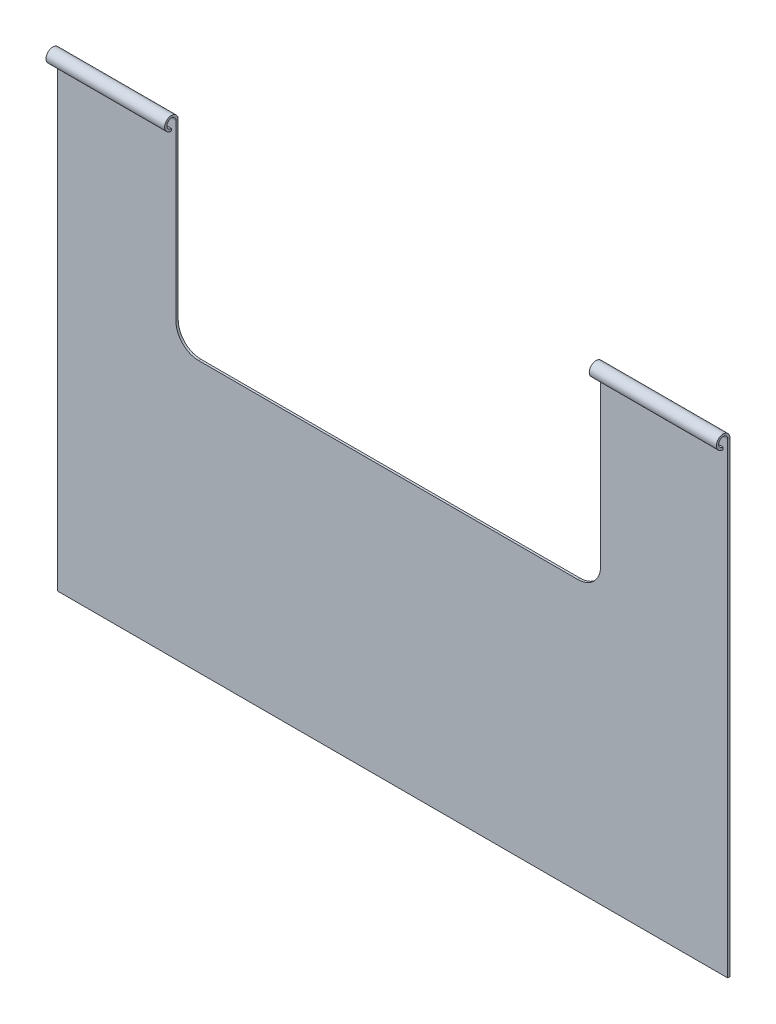
ISO-10303-21;
HEADER;
FILE_DESCRIPTION(('STEP AP214'),'2;1');
FILE_NAME('part.step','',(''),(''),'','','');
FILE_SCHEMA(('AUTOMOTIVE_DESIGN { 1 0 10303 214 1 1 1 1 }'));
ENDSEC;
DATA;
#1=APPLICATION_CONTEXT('core data for automotive mechanical design processes');
#2=APPLICATION_PROTOCOL_DEFINITION('international standard','automotive_design',2000,#1);
#3=PRODUCT_CONTEXT('',#1,'mechanical');
#4=PRODUCT('Part','Part','',(#3));
#5=PRODUCT_RELATED_PRODUCT_CATEGORY('part','',(#4));
#6=PRODUCT_DEFINITION_FORMATION('','',#4);
#7=PRODUCT_DEFINITION_CONTEXT('part definition',#1,'design');
#8=PRODUCT_DEFINITION('design','',#6,#7);
#9=PRODUCT_DEFINITION_SHAPE('','',#8);
#10=(LENGTH_UNIT() NAMED_UNIT(*) SI_UNIT(.MILLI.,.METRE.));
#11=(NAMED_UNIT(*) PLANE_ANGLE_UNIT() SI_UNIT($,.RADIAN.));
#12=(NAMED_UNIT(*) SI_UNIT($,.STERADIAN.) SOLID_ANGLE_UNIT());
#13=UNCERTAINTY_MEASURE_WITH_UNIT(LENGTH_MEASURE(1.E-05),#10,'distance_accuracy_value','');
#14=(GEOMETRIC_REPRESENTATION_CONTEXT(3) GLOBAL_UNCERTAINTY_ASSIGNED_CONTEXT((#13)) GLOBAL_UNIT_ASSIGNED_CONTEXT((#10,
#11,#12)) REPRESENTATION_CONTEXT('',''));
#15=CARTESIAN_POINT('',(0.,0.,0.));
#16=DIRECTION('',(0.,0.,1.));
#17=DIRECTION('',(1.,0.,0.));
#18=AXIS2_PLACEMENT_3D('',#15,#16,#17);
#19=CARTESIAN_POINT('',(45.8957401984779,74.638283062645,-0.5));
#20=DIRECTION('',(-1.,0.,0.));
#21=DIRECTION('',(0.,-1.,0.));
#22=AXIS2_PLACEMENT_3D('',#19,#20,#21);
#23=PLANE('',#22);
#24=DIRECTION('',(0.,-1.,0.));
#25=VECTOR('',#24,1.);
#26=CARTESIAN_POINT('',(45.8957401984779,74.638283062645,-0.5));
#27=LINE('',#26,#25);
#28=CARTESIAN_POINT('',(45.8957401984779,73.138283062645,-0.5));
#29=VERTEX_POINT('',#28);
#30=CARTESIAN_POINT('',(45.8957401984779,34.8052204176334,-0.5));
#31=VERTEX_POINT('',#30);
#32=EDGE_CURVE('E145',#29,#31,#27,.T.);
#33=ORIENTED_EDGE('',*,*,#32,.T.);
#34=DIRECTION('',(0.,0.,1.));
#35=VECTOR('',#34,1.);
#36=CARTESIAN_POINT('',(45.8957401984779,34.8052204176334,0.));
#37=LINE('',#36,#35);
#38=CARTESIAN_POINT('',(45.8957401984779,34.8052204176334,0.));
#39=VERTEX_POINT('',#38);
#40=EDGE_CURVE('E248',#31,#39,#37,.T.);
#41=ORIENTED_EDGE('',*,*,#40,.T.);
#42=DIRECTION('',(0.,-1.,0.));
#43=VECTOR('',#42,1.);
#44=CARTESIAN_POINT('',(45.8957401984779,74.638283062645,0.));
#45=LINE('',#44,#43);
#46=CARTESIAN_POINT('',(45.8957401984779,73.138283062645,0.));
#47=VERTEX_POINT('',#46);
#48=EDGE_CURVE('E222',#47,#39,#45,.T.);
#49=ORIENTED_EDGE('',*,*,#48,.F.);
#50=DIRECTION('',(0.,0.,-1.));
#51=VECTOR('',#50,1.);
#52=CARTESIAN_POINT('',(45.8957401984779,73.138283062645,0.));
#53=LINE('',#52,#51);
#54=EDGE_CURVE('E167',#47,#29,#53,.T.);
#55=ORIENTED_EDGE('',*,*,#54,.T.);
#56=EDGE_LOOP('',(#33,#41,#49,#55));
#57=FACE_BOUND('',#56,.T.);
#58=ADVANCED_FACE('F35',(#57),#23,.T.);
#59=CARTESIAN_POINT('',(-73.9477123562506,-29.8052204176334,-0.5));
#60=DIRECTION('',(-1.,0.,0.));
#61=DIRECTION('',(0.,0.,1.));
#62=AXIS2_PLACEMENT_3D('',#59,#60,#61);
#63=PLANE('',#62);
#64=DIRECTION('',(0.,-1.,0.));
#65=VECTOR('',#64,1.);
#66=CARTESIAN_POINT('',(-73.9477123562506,-29.8052204176334,0.));
#67=LINE('',#66,#65);
#68=CARTESIAN_POINT('',(-73.9477123562506,73.138283062645,0.));
#69=VERTEX_POINT('',#68);
#70=CARTESIAN_POINT('',(-73.9477123562506,-29.8052204176334,0.));
#71=VERTEX_POINT('',#70);
#72=EDGE_CURVE('E241',#69,#71,#67,.T.);
#73=ORIENTED_EDGE('',*,*,#72,.F.);
#74=DIRECTION('',(0.,0.,-1.));
#75=VECTOR('',#74,1.);
#76=CARTESIAN_POINT('',(-73.9477123562506,73.138283062645,0.));
#77=LINE('',#76,#75);
#78=CARTESIAN_POINT('',(-73.9477123562506,73.138283062645,-0.5));
#79=VERTEX_POINT('',#78);
#80=EDGE_CURVE('E198',#69,#79,#77,.T.);
#81=ORIENTED_EDGE('',*,*,#80,.T.);
#82=DIRECTION('',(0.,-1.,0.));
#83=VECTOR('',#82,1.);
#84=CARTESIAN_POINT('',(-73.9477123562506,29.8052204176334,-0.5));
#85=LINE('',#84,#83);
#86=CARTESIAN_POINT('',(-73.9477123562506,-29.8052204176334,-0.5));
#87=VERTEX_POINT('',#86);
#88=EDGE_CURVE('E230',#79,#87,#85,.T.);
#89=ORIENTED_EDGE('',*,*,#88,.T.);
#90=DIRECTION('',(0.,0.,1.));
#91=VECTOR('',#90,1.);
#92=CARTESIAN_POINT('',(-73.9477123562506,-29.8052204176334,-0.5));
#93=LINE('',#92,#91);
#94=EDGE_CURVE('E234',#87,#71,#93,.T.);
#95=ORIENTED_EDGE('',*,*,#94,.T.);
#96=EDGE_LOOP('',(#73,#81,#89,#95));
#97=FACE_BOUND('',#96,.T.);
#98=ADVANCED_FACE('F299',(#97),#63,.T.);
#99=CARTESIAN_POINT('',(73.9477123562506,-29.8052204176334,-0.5));
#100=DIRECTION('',(1.,0.,0.));
#101=DIRECTION('',(0.,0.,-1.));
#102=AXIS2_PLACEMENT_3D('',#99,#100,#101);
#103=PLANE('',#102);
#104=DIRECTION('',(0.,0.,-1.));
#105=VECTOR('',#104,1.);
#106=CARTESIAN_POINT('',(73.9477123562506,73.138283062645,0.));
#107=LINE('',#106,#105);
#108=CARTESIAN_POINT('',(73.9477123562506,73.138283062645,0.));
#109=VERTEX_POINT('',#108);
#110=CARTESIAN_POINT('',(73.9477123562506,73.138283062645,-0.500000000000001));
#111=VERTEX_POINT('',#110);
#112=EDGE_CURVE('E139',#109,#111,#107,.T.);
#113=ORIENTED_EDGE('',*,*,#112,.F.);
#114=DIRECTION('',(0.,1.,0.));
#115=VECTOR('',#114,1.);
#116=CARTESIAN_POINT('',(73.9477123562506,-29.8052204176334,0.));
#117=LINE('',#116,#115);
#118=CARTESIAN_POINT('',(73.9477123562506,-29.8052204176334,0.));
#119=VERTEX_POINT('',#118);
#120=EDGE_CURVE('E146',#119,#109,#117,.T.);
#121=ORIENTED_EDGE('',*,*,#120,.F.);
#122=DIRECTION('',(0.,0.,1.));
#123=VECTOR('',#122,1.);
#124=CARTESIAN_POINT('',(73.9477123562506,-29.8052204176334,-0.5));
#125=LINE('',#124,#123);
#126=CARTESIAN_POINT('',(73.9477123562506,-29.8052204176334,-0.5));
#127=VERTEX_POINT('',#126);
#128=EDGE_CURVE('E141',#127,#119,#125,.T.);
#129=ORIENTED_EDGE('',*,*,#128,.F.);
#130=DIRECTION('',(0.,1.,0.));
#131=VECTOR('',#130,1.);
#132=CARTESIAN_POINT('',(73.9477123562506,29.8052204176334,-0.5));
#133=LINE('',#132,#131);
#134=EDGE_CURVE('E134',#127,#111,#133,.T.);
#135=ORIENTED_EDGE('',*,*,#134,.T.);
#136=EDGE_LOOP('',(#113,#121,#129,#135));
#137=FACE_BOUND('',#136,.T.);
#138=ADVANCED_FACE('F136',(#137),#103,.T.);
#139=CARTESIAN_POINT('',(-73.9477123562506,-29.8052204176334,-0.5));
#140=DIRECTION('',(0.,-1.,0.));
#141=DIRECTION('',(0.,0.,-1.));
#142=AXIS2_PLACEMENT_3D('',#139,#140,#141);
#143=PLANE('',#142);
#144=DIRECTION('',(1.,0.,0.));
#145=VECTOR('',#144,1.);
#146=CARTESIAN_POINT('',(-73.9477123562506,-29.8052204176334,0.));
#147=LINE('',#146,#145);
#148=EDGE_CURVE('E243',#71,#119,#147,.T.);
#149=ORIENTED_EDGE('',*,*,#148,.F.);
#150=ORIENTED_EDGE('',*,*,#94,.F.);
#151=DIRECTION('',(1.,0.,0.));
#152=VECTOR('',#151,1.);
#153=CARTESIAN_POINT('',(-73.9477123562506,-29.8052204176334,-0.5));
#154=LINE('',#153,#152);
#155=EDGE_CURVE('E232',#87,#127,#154,.T.);
#156=ORIENTED_EDGE('',*,*,#155,.T.);
#157=ORIENTED_EDGE('',*,*,#128,.T.);
#158=EDGE_LOOP('',(#149,#150,#156,#157));
#159=FACE_BOUND('',#158,.T.);
#160=ADVANCED_FACE('F347',(#159),#143,.T.);
#161=CARTESIAN_POINT('',(-47.7778096855128,74.638283062645,-0.5));
#162=DIRECTION('',(1.,0.,0.));
#163=DIRECTION('',(0.,0.,-1.));
#164=AXIS2_PLACEMENT_3D('',#161,#162,#163);
#165=PLANE('',#164);
#166=DIRECTION('',(0.,1.,0.));
#167=VECTOR('',#166,1.);
#168=CARTESIAN_POINT('',(-47.7778096855128,74.638283062645,0.));
#169=LINE('',#168,#167);
#170=CARTESIAN_POINT('',(-47.7778096855128,34.8052204176334,0.));
#171=VERTEX_POINT('',#170);
#172=CARTESIAN_POINT('',(-47.7778096855128,73.138283062645,0.));
#173=VERTEX_POINT('',#172);
#174=EDGE_CURVE('E239',#171,#173,#169,.T.);
#175=ORIENTED_EDGE('',*,*,#174,.F.);
#176=DIRECTION('',(0.,0.,1.));
#177=VECTOR('',#176,1.);
#178=CARTESIAN_POINT('',(-47.7778096855128,34.8052204176334,-0.5));
#179=LINE('',#178,#177);
#180=CARTESIAN_POINT('',(-47.7778096855128,34.8052204176334,-0.5));
#181=VERTEX_POINT('',#180);
#182=EDGE_CURVE('E50',#171,#181,#179,.F.);
#183=ORIENTED_EDGE('',*,*,#182,.T.);
#184=DIRECTION('',(0.,1.,0.));
#185=VECTOR('',#184,1.);
#186=CARTESIAN_POINT('',(-47.7778096855128,74.638283062645,-0.5));
#187=LINE('',#186,#185);
#188=CARTESIAN_POINT('',(-47.7778096855128,73.138283062645,-0.500000000000001));
#189=VERTEX_POINT('',#188);
#190=EDGE_CURVE('E228',#181,#189,#187,.T.);
#191=ORIENTED_EDGE('',*,*,#190,.T.);
#192=DIRECTION('',(0.,0.,-1.));
#193=VECTOR('',#192,1.);
#194=CARTESIAN_POINT('',(-47.7778096855128,73.138283062645,0.));
#195=LINE('',#194,#193);
#196=EDGE_CURVE('E215',#173,#189,#195,.T.);
#197=ORIENTED_EDGE('',*,*,#196,.F.);
#198=EDGE_LOOP('',(#175,#183,#191,#197));
#199=FACE_BOUND('',#198,.T.);
#200=ADVANCED_FACE('F281',(#199),#165,.T.);
#201=CARTESIAN_POINT('',(-47.7778096855128,29.8052204176334,-0.5));
#202=DIRECTION('',(0.,1.,0.));
#203=DIRECTION('',(0.,0.,1.));
#204=AXIS2_PLACEMENT_3D('',#201,#202,#203);
#205=PLANE('',#204);
#206=DIRECTION('',(-1.,0.,0.));
#207=VECTOR('',#206,1.);
#208=CARTESIAN_POINT('',(-47.7778096855128,29.8052204176334,0.));
#209=LINE('',#208,#207);
#210=CARTESIAN_POINT('',(40.8957401984779,29.8052204176334,0.));
#211=VERTEX_POINT('',#210);
#212=CARTESIAN_POINT('',(-42.7778096855128,29.8052204176334,0.));
#213=VERTEX_POINT('',#212);
#214=EDGE_CURVE('E237',#211,#213,#209,.T.);
#215=ORIENTED_EDGE('',*,*,#214,.F.);
#216=DIRECTION('',(0.,0.,1.));
#217=VECTOR('',#216,1.);
#218=CARTESIAN_POINT('',(40.8957401984779,29.8052204176334,-0.5));
#219=LINE('',#218,#217);
#220=CARTESIAN_POINT('',(40.8957401984779,29.8052204176334,-0.5));
#221=VERTEX_POINT('',#220);
#222=EDGE_CURVE('E256',#211,#221,#219,.F.);
#223=ORIENTED_EDGE('',*,*,#222,.T.);
#224=DIRECTION('',(-1.,0.,0.));
#225=VECTOR('',#224,1.);
#226=CARTESIAN_POINT('',(-47.7778096855128,29.8052204176334,-0.5));
#227=LINE('',#226,#225);
#228=CARTESIAN_POINT('',(-42.7778096855128,29.8052204176334,-0.5));
#229=VERTEX_POINT('',#228);
#230=EDGE_CURVE('E225',#221,#229,#227,.T.);
#231=ORIENTED_EDGE('',*,*,#230,.T.);
#232=DIRECTION('',(0.,0.,1.));
#233=VECTOR('',#232,1.);
#234=CARTESIAN_POINT('',(-42.7778096855128,29.8052204176334,0.));
#235=LINE('',#234,#233);
#236=EDGE_CURVE('E253',#229,#213,#235,.T.);
#237=ORIENTED_EDGE('',*,*,#236,.T.);
#238=EDGE_LOOP('',(#215,#223,#231,#237));
#239=FACE_BOUND('',#238,.T.);
#240=ADVANCED_FACE('F274',(#239),#205,.T.);
#241=CARTESIAN_POINT('',(0.,0.,-0.5));
#242=DIRECTION('',(0.,0.,1.));
#243=DIRECTION('',(1.,0.,0.));
#244=AXIS2_PLACEMENT_3D('',#241,#242,#243);
#245=PLANE('',#244);
#246=ORIENTED_EDGE('',*,*,#32,.F.);
#247=DIRECTION('',(-1.,0.,0.));
#248=VECTOR('',#247,1.);
#249=CARTESIAN_POINT('',(45.8957401984779,73.138283062645,-0.500000000000001));
#250=LINE('',#249,#248);
#251=EDGE_CURVE('E150',#29,#111,#250,.F.);
#252=ORIENTED_EDGE('',*,*,#251,.T.);
#253=ORIENTED_EDGE('',*,*,#134,.F.);
#254=ORIENTED_EDGE('',*,*,#155,.F.);
#255=ORIENTED_EDGE('',*,*,#88,.F.);
#256=DIRECTION('',(-1.,0.,0.));
#257=VECTOR('',#256,1.);
#258=CARTESIAN_POINT('',(-73.9477123562506,73.138283062645,-0.500000000000001));
#259=LINE('',#258,#257);
#260=EDGE_CURVE('E191',#79,#189,#259,.F.);
#261=ORIENTED_EDGE('',*,*,#260,.T.);
#262=ORIENTED_EDGE('',*,*,#190,.F.);
#263=CARTESIAN_POINT('',(-42.7778096855128,34.8052204176334,-0.5));
#264=DIRECTION('',(0.,0.,1.));
#265=DIRECTION('',(1.,0.,0.));
#266=AXIS2_PLACEMENT_3D('',#263,#264,#265);
#267=CIRCLE('',#266,5.);
#268=EDGE_CURVE('E11',#181,#229,#267,.T.);
#269=ORIENTED_EDGE('',*,*,#268,.T.);
#270=ORIENTED_EDGE('',*,*,#230,.F.);
#271=CARTESIAN_POINT('',(40.8957401984779,34.8052204176334,-0.5));
#272=DIRECTION('',(0.,0.,1.));
#273=DIRECTION('',(1.,0.,0.));
#274=AXIS2_PLACEMENT_3D('',#271,#272,#273);
#275=CIRCLE('',#274,5.);
#276=EDGE_CURVE('E261',#221,#31,#275,.T.);
#277=ORIENTED_EDGE('',*,*,#276,.T.);
#278=EDGE_LOOP('',(#246,#252,#253,#254,#255,#261,#262,#269,#270,#277));
#279=FACE_BOUND('',#278,.T.);
#280=ADVANCED_FACE('F151',(#279),#245,.F.);
#281=CARTESIAN_POINT('',(0.,0.,0.));
#282=DIRECTION('',(0.,0.,1.));
#283=DIRECTION('',(1.,0.,0.));
#284=AXIS2_PLACEMENT_3D('',#281,#282,#283);
#285=PLANE('',#284);
#286=DIRECTION('',(-1.,0.,0.));
#287=VECTOR('',#286,1.);
#288=CARTESIAN_POINT('',(45.8957401984779,73.138283062645,0.));
#289=LINE('',#288,#287);
#290=EDGE_CURVE('E179',#47,#109,#289,.F.);
#291=ORIENTED_EDGE('',*,*,#290,.F.);
#292=ORIENTED_EDGE('',*,*,#48,.T.);
#293=CARTESIAN_POINT('',(40.8957401984779,34.8052204176334,0.));
#294=DIRECTION('',(0.,0.,1.));
#295=DIRECTION('',(1.,0.,0.));
#296=AXIS2_PLACEMENT_3D('',#293,#294,#295);
#297=CIRCLE('',#296,5.);
#298=EDGE_CURVE('E259',#39,#211,#297,.F.);
#299=ORIENTED_EDGE('',*,*,#298,.T.);
#300=ORIENTED_EDGE('',*,*,#214,.T.);
#301=CARTESIAN_POINT('',(-42.7778096855128,34.8052204176334,0.));
#302=DIRECTION('',(0.,0.,1.));
#303=DIRECTION('',(1.,0.,0.));
#304=AXIS2_PLACEMENT_3D('',#301,#302,#303);
#305=CIRCLE('',#304,5.);
#306=EDGE_CURVE('E43',#213,#171,#305,.F.);
#307=ORIENTED_EDGE('',*,*,#306,.T.);
#308=ORIENTED_EDGE('',*,*,#174,.T.);
#309=DIRECTION('',(-1.,0.,0.));
#310=VECTOR('',#309,1.);
#311=CARTESIAN_POINT('',(-73.9477123562506,73.138283062645,0.));
#312=LINE('',#311,#310);
#313=EDGE_CURVE('E207',#69,#173,#312,.F.);
#314=ORIENTED_EDGE('',*,*,#313,.F.);
#315=ORIENTED_EDGE('',*,*,#72,.T.);
#316=ORIENTED_EDGE('',*,*,#148,.T.);
#317=ORIENTED_EDGE('',*,*,#120,.T.);
#318=EDGE_LOOP('',(#291,#292,#299,#300,#307,#308,#314,#315,#316,#317));
#319=FACE_BOUND('',#318,.T.);
#320=ADVANCED_FACE('F272',(#319),#285,.T.);
#321=CARTESIAN_POINT('',(-60.8627610208817,72.138283062645,0.999999999999991));
#322=DIRECTION('',(0.,0.,1.));
#323=DIRECTION('',(-1.,0.,0.));
#324=AXIS2_PLACEMENT_3D('',#321,#322,#323);
#325=PLANE('',#324);
#326=DIRECTION('',(0.,-1.,0.));
#327=VECTOR('',#326,1.);
#328=CARTESIAN_POINT('',(-73.9477123562506,72.138283062645,0.999999999999991));
#329=LINE('',#328,#327);
#330=CARTESIAN_POINT('',(-73.9477123562506,72.138283062645,0.999999999999991));
#331=VERTEX_POINT('',#330);
#332=CARTESIAN_POINT('',(-73.9477123562506,71.638283062645,0.999999999999987));
#333=VERTEX_POINT('',#332);
#334=EDGE_CURVE('E220',#331,#333,#329,.T.);
#335=ORIENTED_EDGE('',*,*,#334,.F.);
#336=DIRECTION('',(-1.,0.,0.));
#337=VECTOR('',#336,1.);
#338=CARTESIAN_POINT('',(-73.9477123562506,72.138283062645,0.999999999999991));
#339=LINE('',#338,#337);
#340=CARTESIAN_POINT('',(-47.7778096855128,72.138283062645,0.999999999999991));
#341=VERTEX_POINT('',#340);
#342=EDGE_CURVE('E189',#341,#331,#339,.T.);
#343=ORIENTED_EDGE('',*,*,#342,.F.);
#344=DIRECTION('',(0.,-1.,0.));
#345=VECTOR('',#344,1.);
#346=CARTESIAN_POINT('',(-47.7778096855128,72.138283062645,0.999999999999991));
#347=LINE('',#346,#345);
#348=CARTESIAN_POINT('',(-47.7778096855128,71.638283062645,0.999999999999987));
#349=VERTEX_POINT('',#348);
#350=EDGE_CURVE('E218',#341,#349,#347,.T.);
#351=ORIENTED_EDGE('',*,*,#350,.T.);
#352=DIRECTION('',(-1.,0.,0.));
#353=VECTOR('',#352,1.);
#354=CARTESIAN_POINT('',(-73.9477123562506,71.638283062645,0.999999999999987));
#355=LINE('',#354,#353);
#356=EDGE_CURVE('E199',#349,#333,#355,.T.);
#357=ORIENTED_EDGE('',*,*,#356,.T.);
#358=EDGE_LOOP('',(#335,#343,#351,#357));
#359=FACE_BOUND('',#358,.T.);
#360=ADVANCED_FACE('F293',(#359),#325,.F.);
#361=CARTESIAN_POINT('',(-47.7778096855128,73.138283062645,1.));
#362=DIRECTION('',(1.,0.,0.));
#363=DIRECTION('',(0.,0.,-1.));
#364=AXIS2_PLACEMENT_3D('',#361,#362,#363);
#365=PLANE('',#364);
#366=ORIENTED_EDGE('',*,*,#350,.F.);
#367=CARTESIAN_POINT('',(-47.7778096855128,73.138283062645,1.));
#368=DIRECTION('',(-1.,0.,0.));
#369=DIRECTION('',(0.,0.,1.));
#370=AXIS2_PLACEMENT_3D('',#367,#368,#369);
#371=CIRCLE('',#370,1.);
#372=EDGE_CURVE('E202',#173,#341,#371,.F.);
#373=ORIENTED_EDGE('',*,*,#372,.F.);
#374=ORIENTED_EDGE('',*,*,#196,.T.);
#375=CARTESIAN_POINT('',(-47.7778096855128,73.138283062645,1.));
#376=DIRECTION('',(-1.,0.,0.));
#377=DIRECTION('',(0.,0.,1.));
#378=AXIS2_PLACEMENT_3D('',#375,#376,#377);
#379=CIRCLE('',#378,1.5);
#380=EDGE_CURVE('E194',#189,#349,#379,.F.);
#381=ORIENTED_EDGE('',*,*,#380,.T.);
#382=EDGE_LOOP('',(#366,#373,#374,#381));
#383=FACE_BOUND('',#382,.T.);
#384=ADVANCED_FACE('F289',(#383),#365,.T.);
#385=CARTESIAN_POINT('',(-73.9477123562506,73.138283062645,1.));
#386=DIRECTION('',(1.,0.,0.));
#387=DIRECTION('',(0.,0.,-1.));
#388=AXIS2_PLACEMENT_3D('',#385,#386,#387);
#389=PLANE('',#388);
#390=CARTESIAN_POINT('',(-73.9477123562506,73.138283062645,1.));
#391=DIRECTION('',(-1.,0.,0.));
#392=DIRECTION('',(0.,0.,1.));
#393=AXIS2_PLACEMENT_3D('',#390,#391,#392);
#394=CIRCLE('',#393,1.);
#395=EDGE_CURVE('E210',#331,#69,#394,.T.);
#396=ORIENTED_EDGE('',*,*,#395,.F.);
#397=ORIENTED_EDGE('',*,*,#334,.T.);
#398=CARTESIAN_POINT('',(-73.9477123562506,73.138283062645,1.));
#399=DIRECTION('',(-1.,0.,0.));
#400=DIRECTION('',(0.,0.,1.));
#401=AXIS2_PLACEMENT_3D('',#398,#399,#400);
#402=CIRCLE('',#401,1.5);
#403=EDGE_CURVE('E195',#333,#79,#402,.T.);
#404=ORIENTED_EDGE('',*,*,#403,.T.);
#405=ORIENTED_EDGE('',*,*,#80,.F.);
#406=EDGE_LOOP('',(#396,#397,#404,#405));
#407=FACE_BOUND('',#406,.T.);
#408=ADVANCED_FACE('F296',(#407),#389,.F.);
#409=CARTESIAN_POINT('',(-73.9477123562506,73.138283062645,1.));
#410=DIRECTION('',(-1.,0.,0.));
#411=DIRECTION('',(0.,-1.,0.));
#412=AXIS2_PLACEMENT_3D('',#409,#410,#411);
#413=CYLINDRICAL_SURFACE('',#412,1.5);
#414=ORIENTED_EDGE('',*,*,#260,.F.);
#415=ORIENTED_EDGE('',*,*,#403,.F.);
#416=ORIENTED_EDGE('',*,*,#356,.F.);
#417=ORIENTED_EDGE('',*,*,#380,.F.);
#418=EDGE_LOOP('',(#414,#415,#416,#417));
#419=FACE_BOUND('',#418,.T.);
#420=ADVANCED_FACE('F302',(#419),#413,.T.);
#421=CARTESIAN_POINT('',(-73.9477123562506,73.138283062645,1.));
#422=DIRECTION('',(-1.,0.,0.));
#423=DIRECTION('',(0.,-1.,0.));
#424=AXIS2_PLACEMENT_3D('',#421,#422,#423);
#425=CYLINDRICAL_SURFACE('',#424,1.);
#426=ORIENTED_EDGE('',*,*,#313,.T.);
#427=ORIENTED_EDGE('',*,*,#372,.T.);
#428=ORIENTED_EDGE('',*,*,#342,.T.);
#429=ORIENTED_EDGE('',*,*,#395,.T.);
#430=EDGE_LOOP('',(#426,#427,#428,#429));
#431=FACE_BOUND('',#430,.T.);
#432=ADVANCED_FACE('F286',(#431),#425,.F.);
#433=CARTESIAN_POINT('',(59.9217262773643,72.138283062645,0.999999999999991));
#434=DIRECTION('',(0.,0.,1.));
#435=DIRECTION('',(-1.,0.,0.));
#436=AXIS2_PLACEMENT_3D('',#433,#434,#435);
#437=PLANE('',#436);
#438=DIRECTION('',(0.,-1.,0.));
#439=VECTOR('',#438,1.);
#440=CARTESIAN_POINT('',(45.8957401984779,72.138283062645,0.999999999999991));
#441=LINE('',#440,#439);
#442=CARTESIAN_POINT('',(45.8957401984779,72.138283062645,0.999999999999991));
#443=VERTEX_POINT('',#442);
#444=CARTESIAN_POINT('',(45.8957401984779,71.638283062645,0.999999999999987));
#445=VERTEX_POINT('',#444);
#446=EDGE_CURVE('E188',#443,#445,#441,.T.);
#447=ORIENTED_EDGE('',*,*,#446,.F.);
#448=DIRECTION('',(-1.,0.,0.));
#449=VECTOR('',#448,1.);
#450=CARTESIAN_POINT('',(45.8957401984779,72.138283062645,0.999999999999991));
#451=LINE('',#450,#449);
#452=CARTESIAN_POINT('',(73.9477123562506,72.138283062645,0.999999999999991));
#453=VERTEX_POINT('',#452);
#454=EDGE_CURVE('E184',#453,#443,#451,.T.);
#455=ORIENTED_EDGE('',*,*,#454,.F.);
#456=DIRECTION('',(0.,-1.,0.));
#457=VECTOR('',#456,1.);
#458=CARTESIAN_POINT('',(73.9477123562506,72.138283062645,0.999999999999991));
#459=LINE('',#458,#457);
#460=CARTESIAN_POINT('',(73.9477123562506,71.638283062645,0.999999999999987));
#461=VERTEX_POINT('',#460);
#462=EDGE_CURVE('E166',#453,#461,#459,.T.);
#463=ORIENTED_EDGE('',*,*,#462,.T.);
#464=DIRECTION('',(-1.,0.,0.));
#465=VECTOR('',#464,1.);
#466=CARTESIAN_POINT('',(45.8957401984779,71.638283062645,0.999999999999987));
#467=LINE('',#466,#465);
#468=EDGE_CURVE('E172',#461,#445,#467,.T.);
#469=ORIENTED_EDGE('',*,*,#468,.T.);
#470=EDGE_LOOP('',(#447,#455,#463,#469));
#471=FACE_BOUND('',#470,.T.);
#472=ADVANCED_FACE('F309',(#471),#437,.F.);
#473=CARTESIAN_POINT('',(73.9477123562506,73.138283062645,1.));
#474=DIRECTION('',(1.,0.,0.));
#475=DIRECTION('',(0.,0.,-1.));
#476=AXIS2_PLACEMENT_3D('',#473,#474,#475);
#477=PLANE('',#476);
#478=ORIENTED_EDGE('',*,*,#462,.F.);
#479=CARTESIAN_POINT('',(73.9477123562506,73.138283062645,1.));
#480=DIRECTION('',(-1.,0.,0.));
#481=DIRECTION('',(0.,0.,1.));
#482=AXIS2_PLACEMENT_3D('',#479,#480,#481);
#483=CIRCLE('',#482,1.);
#484=EDGE_CURVE('E165',#109,#453,#483,.F.);
#485=ORIENTED_EDGE('',*,*,#484,.F.);
#486=ORIENTED_EDGE('',*,*,#112,.T.);
#487=CARTESIAN_POINT('',(73.9477123562506,73.138283062645,1.));
#488=DIRECTION('',(-1.,0.,0.));
#489=DIRECTION('',(0.,0.,1.));
#490=AXIS2_PLACEMENT_3D('',#487,#488,#489);
#491=CIRCLE('',#490,1.5);
#492=EDGE_CURVE('E157',#111,#461,#491,.F.);
#493=ORIENTED_EDGE('',*,*,#492,.T.);
#494=EDGE_LOOP('',(#478,#485,#486,#493));
#495=FACE_BOUND('',#494,.T.);
#496=ADVANCED_FACE('F163',(#495),#477,.T.);
#497=CARTESIAN_POINT('',(45.8957401984779,73.138283062645,1.));
#498=DIRECTION('',(1.,0.,0.));
#499=DIRECTION('',(0.,0.,-1.));
#500=AXIS2_PLACEMENT_3D('',#497,#498,#499);
#501=PLANE('',#500);
#502=CARTESIAN_POINT('',(45.8957401984779,73.138283062645,1.));
#503=DIRECTION('',(-1.,0.,0.));
#504=DIRECTION('',(0.,0.,1.));
#505=AXIS2_PLACEMENT_3D('',#502,#503,#504);
#506=CIRCLE('',#505,1.);
#507=EDGE_CURVE('E181',#443,#47,#506,.T.);
#508=ORIENTED_EDGE('',*,*,#507,.F.);
#509=ORIENTED_EDGE('',*,*,#446,.T.);
#510=CARTESIAN_POINT('',(45.8957401984779,73.138283062645,1.));
#511=DIRECTION('',(-1.,0.,0.));
#512=DIRECTION('',(0.,0.,1.));
#513=AXIS2_PLACEMENT_3D('',#510,#511,#512);
#514=CIRCLE('',#513,1.5);
#515=EDGE_CURVE('E158',#445,#29,#514,.T.);
#516=ORIENTED_EDGE('',*,*,#515,.T.);
#517=ORIENTED_EDGE('',*,*,#54,.F.);
#518=EDGE_LOOP('',(#508,#509,#516,#517));
#519=FACE_BOUND('',#518,.T.);
#520=ADVANCED_FACE('F332',(#519),#501,.F.);
#521=CARTESIAN_POINT('',(45.8957401984779,73.138283062645,1.));
#522=DIRECTION('',(-1.,0.,0.));
#523=DIRECTION('',(0.,-1.,0.));
#524=AXIS2_PLACEMENT_3D('',#521,#522,#523);
#525=CYLINDRICAL_SURFACE('',#524,1.5);
#526=ORIENTED_EDGE('',*,*,#251,.F.);
#527=ORIENTED_EDGE('',*,*,#515,.F.);
#528=ORIENTED_EDGE('',*,*,#468,.F.);
#529=ORIENTED_EDGE('',*,*,#492,.F.);
#530=EDGE_LOOP('',(#526,#527,#528,#529));
#531=FACE_BOUND('',#530,.T.);
#532=ADVANCED_FACE('F170',(#531),#525,.T.);
#533=CARTESIAN_POINT('',(45.8957401984779,73.138283062645,1.));
#534=DIRECTION('',(-1.,0.,0.));
#535=DIRECTION('',(0.,-1.,0.));
#536=AXIS2_PLACEMENT_3D('',#533,#534,#535);
#537=CYLINDRICAL_SURFACE('',#536,1.);
#538=ORIENTED_EDGE('',*,*,#290,.T.);
#539=ORIENTED_EDGE('',*,*,#484,.T.);
#540=ORIENTED_EDGE('',*,*,#454,.T.);
#541=ORIENTED_EDGE('',*,*,#507,.T.);
#542=EDGE_LOOP('',(#538,#539,#540,#541));
#543=FACE_BOUND('',#542,.T.);
#544=ADVANCED_FACE('F322',(#543),#537,.F.);
#545=CARTESIAN_POINT('',(40.8957401984779,34.8052204176334,-0.5));
#546=DIRECTION('',(0.,0.,-1.));
#547=DIRECTION('',(-1.,0.,0.));
#548=AXIS2_PLACEMENT_3D('',#545,#546,#547);
#549=CYLINDRICAL_SURFACE('',#548,5.);
#550=ORIENTED_EDGE('',*,*,#276,.F.);
#551=ORIENTED_EDGE('',*,*,#222,.F.);
#552=ORIENTED_EDGE('',*,*,#298,.F.);
#553=ORIENTED_EDGE('',*,*,#40,.F.);
#554=EDGE_LOOP('',(#550,#551,#552,#553));
#555=FACE_BOUND('',#554,.T.);
#556=ADVANCED_FACE('F270',(#555),#549,.F.);
#557=CARTESIAN_POINT('',(-42.7778096855128,34.8052204176334,-0.5));
#558=DIRECTION('',(0.,0.,-1.));
#559=DIRECTION('',(-1.,0.,0.));
#560=AXIS2_PLACEMENT_3D('',#557,#558,#559);
#561=CYLINDRICAL_SURFACE('',#560,5.);
#562=ORIENTED_EDGE('',*,*,#268,.F.);
#563=ORIENTED_EDGE('',*,*,#182,.F.);
#564=ORIENTED_EDGE('',*,*,#306,.F.);
#565=ORIENTED_EDGE('',*,*,#236,.F.);
#566=EDGE_LOOP('',(#562,#563,#564,#565));
#567=FACE_BOUND('',#566,.T.);
#568=ADVANCED_FACE('F37',(#567),#561,.F.);
#569=CLOSED_SHELL('',(#58,#98,#138,#160,#200,#240,#280,#320,#360,#384,#408,#420,#432,#472,#496,
#520,#532,#544,#556,#568));
#570=MANIFOLD_SOLID_BREP('B2',#569);
#571=ADVANCED_BREP_SHAPE_REPRESENTATION('',(#18,#570),#14);
#572=SHAPE_DEFINITION_REPRESENTATION(#9,#571);
ENDSEC;
END-ISO-10303-21;
